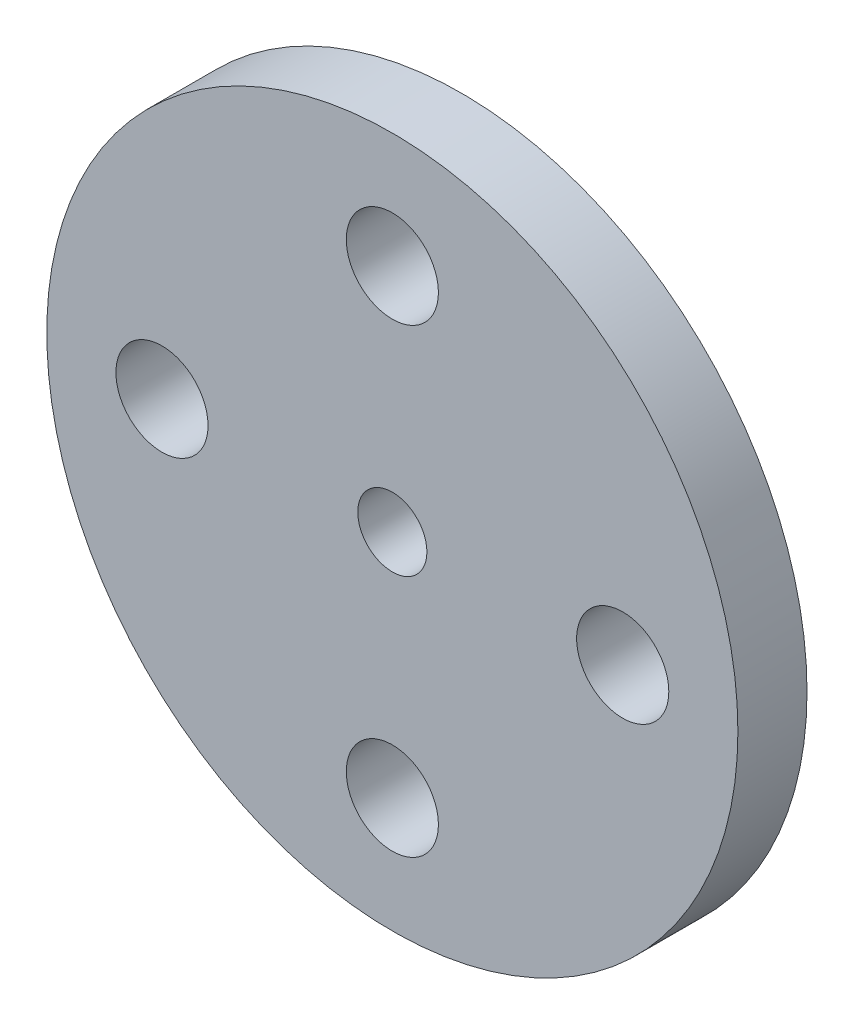
ISO-10303-21;
HEADER;
FILE_DESCRIPTION(('STEP AP214'),'2;1');
FILE_NAME('part.step','',(''),(''),'','','');
FILE_SCHEMA(('AUTOMOTIVE_DESIGN { 1 0 10303 214 1 1 1 1 }'));
ENDSEC;
DATA;
#1=APPLICATION_CONTEXT('core data for automotive mechanical design processes');
#2=APPLICATION_PROTOCOL_DEFINITION('international standard','automotive_design',2000,#1);
#3=PRODUCT_CONTEXT('',#1,'mechanical');
#4=PRODUCT('Part','Part','',(#3));
#5=PRODUCT_RELATED_PRODUCT_CATEGORY('part','',(#4));
#6=PRODUCT_DEFINITION_FORMATION('','',#4);
#7=PRODUCT_DEFINITION_CONTEXT('part definition',#1,'design');
#8=PRODUCT_DEFINITION('design','',#6,#7);
#9=PRODUCT_DEFINITION_SHAPE('','',#8);
#10=(LENGTH_UNIT() NAMED_UNIT(*) SI_UNIT(.MILLI.,.METRE.));
#11=(NAMED_UNIT(*) PLANE_ANGLE_UNIT() SI_UNIT($,.RADIAN.));
#12=(NAMED_UNIT(*) SI_UNIT($,.STERADIAN.) SOLID_ANGLE_UNIT());
#13=UNCERTAINTY_MEASURE_WITH_UNIT(LENGTH_MEASURE(1.E-05),#10,'distance_accuracy_value','');
#14=(GEOMETRIC_REPRESENTATION_CONTEXT(3) GLOBAL_UNCERTAINTY_ASSIGNED_CONTEXT((#13)) GLOBAL_UNIT_ASSIGNED_CONTEXT((#10,
#11,#12)) REPRESENTATION_CONTEXT('',''));
#15=CARTESIAN_POINT('',(0.,0.,0.));
#16=DIRECTION('',(0.,0.,1.));
#17=DIRECTION('',(1.,0.,0.));
#18=AXIS2_PLACEMENT_3D('',#15,#16,#17);
#19=CARTESIAN_POINT('',(0.,0.,0.));
#20=DIRECTION('',(0.,0.,1.));
#21=DIRECTION('',(1.,0.,0.));
#22=AXIS2_PLACEMENT_3D('',#19,#20,#21);
#23=PLANE('',#22);
#24=CARTESIAN_POINT('',(0.,0.,0.));
#25=DIRECTION('',(0.,0.,1.));
#26=DIRECTION('',(1.,0.,0.));
#27=AXIS2_PLACEMENT_3D('',#24,#25,#26);
#28=CIRCLE('',#27,4.5);
#29=CARTESIAN_POINT('',(4.5,0.,0.));
#30=VERTEX_POINT('',#29);
#31=EDGE_CURVE('E35',#30,#30,#28,.T.);
#32=ORIENTED_EDGE('',*,*,#31,.F.);
#33=EDGE_LOOP('',(#32));
#34=FACE_BOUND('',#33,.T.);
#35=CARTESIAN_POINT('',(0.,0.,0.));
#36=DIRECTION('',(0.,0.,1.));
#37=DIRECTION('',(1.,0.,0.));
#38=AXIS2_PLACEMENT_3D('',#35,#36,#37);
#39=CIRCLE('',#38,3.5);
#40=CARTESIAN_POINT('',(3.5,0.,0.));
#41=VERTEX_POINT('',#40);
#42=EDGE_CURVE('E42',#41,#41,#39,.T.);
#43=ORIENTED_EDGE('',*,*,#42,.T.);
#44=EDGE_LOOP('',(#43));
#45=FACE_BOUND('',#44,.T.);
#46=ADVANCED_FACE('F31',(#34,#45),#23,.F.);
#47=CARTESIAN_POINT('',(0.,0.,5.));
#48=DIRECTION('',(0.,0.,-1.));
#49=DIRECTION('',(-1.,0.,0.));
#50=AXIS2_PLACEMENT_3D('',#47,#48,#49);
#51=CYLINDRICAL_SURFACE('',#50,4.5);
#52=CARTESIAN_POINT('',(0.,0.,5.));
#53=DIRECTION('',(0.,0.,1.));
#54=DIRECTION('',(1.,0.,0.));
#55=AXIS2_PLACEMENT_3D('',#52,#53,#54);
#56=CIRCLE('',#55,4.5);
#57=CARTESIAN_POINT('',(4.5,0.,5.));
#58=VERTEX_POINT('',#57);
#59=EDGE_CURVE('E10',#58,#58,#56,.T.);
#60=ORIENTED_EDGE('',*,*,#59,.F.);
#61=EDGE_LOOP('',(#60));
#62=FACE_BOUND('',#61,.T.);
#63=ORIENTED_EDGE('',*,*,#31,.T.);
#64=EDGE_LOOP('',(#63));
#65=FACE_BOUND('',#64,.T.);
#66=ADVANCED_FACE('F33',(#62,#65),#51,.T.);
#67=CARTESIAN_POINT('',(0.,0.,5.));
#68=DIRECTION('',(0.,0.,-1.));
#69=DIRECTION('',(-1.,0.,0.));
#70=AXIS2_PLACEMENT_3D('',#67,#68,#69);
#71=CYLINDRICAL_SURFACE('',#70,3.5);
#72=CARTESIAN_POINT('',(0.,0.,5.));
#73=DIRECTION('',(0.,0.,1.));
#74=DIRECTION('',(1.,0.,0.));
#75=AXIS2_PLACEMENT_3D('',#72,#73,#74);
#76=CIRCLE('',#75,3.5);
#77=CARTESIAN_POINT('',(3.5,0.,5.));
#78=VERTEX_POINT('',#77);
#79=EDGE_CURVE('E46',#78,#78,#76,.T.);
#80=ORIENTED_EDGE('',*,*,#79,.T.);
#81=EDGE_LOOP('',(#80));
#82=FACE_BOUND('',#81,.T.);
#83=ORIENTED_EDGE('',*,*,#42,.F.);
#84=EDGE_LOOP('',(#83));
#85=FACE_BOUND('',#84,.T.);
#86=ADVANCED_FACE('F129',(#82,#85),#71,.F.);
#87=CARTESIAN_POINT('',(0.,0.,5.));
#88=DIRECTION('',(0.,0.,1.));
#89=DIRECTION('',(1.,0.,0.));
#90=AXIS2_PLACEMENT_3D('',#87,#88,#89);
#91=PLANE('',#90);
#92=CARTESIAN_POINT('',(0.,0.,5.));
#93=DIRECTION('',(0.,0.,1.));
#94=DIRECTION('',(1.,0.,0.));
#95=AXIS2_PLACEMENT_3D('',#92,#93,#94);
#96=CIRCLE('',#95,1.5);
#97=CARTESIAN_POINT('',(1.5,0.,5.));
#98=VERTEX_POINT('',#97);
#99=EDGE_CURVE('E60',#98,#98,#96,.T.);
#100=ORIENTED_EDGE('',*,*,#99,.T.);
#101=EDGE_LOOP('',(#100));
#102=FACE_BOUND('',#101,.T.);
#103=ORIENTED_EDGE('',*,*,#79,.F.);
#104=EDGE_LOOP('',(#103));
#105=FACE_BOUND('',#104,.T.);
#106=ADVANCED_FACE('F86',(#102,#105),#91,.F.);
#107=CARTESIAN_POINT('',(0.,0.,8.));
#108=DIRECTION('',(0.,0.,-1.));
#109=DIRECTION('',(-1.,0.,0.));
#110=AXIS2_PLACEMENT_3D('',#107,#108,#109);
#111=CYLINDRICAL_SURFACE('',#110,15.);
#112=CARTESIAN_POINT('',(0.,0.,8.));
#113=DIRECTION('',(0.,0.,1.));
#114=DIRECTION('',(1.,0.,0.));
#115=AXIS2_PLACEMENT_3D('',#112,#113,#114);
#116=CIRCLE('',#115,15.);
#117=CARTESIAN_POINT('',(15.,0.,8.));
#118=VERTEX_POINT('',#117);
#119=EDGE_CURVE('E49',#118,#118,#116,.T.);
#120=ORIENTED_EDGE('',*,*,#119,.F.);
#121=EDGE_LOOP('',(#120));
#122=FACE_BOUND('',#121,.T.);
#123=CARTESIAN_POINT('',(0.,0.,5.));
#124=DIRECTION('',(0.,0.,1.));
#125=DIRECTION('',(1.,0.,0.));
#126=AXIS2_PLACEMENT_3D('',#123,#124,#125);
#127=CIRCLE('',#126,15.);
#128=CARTESIAN_POINT('',(15.,0.,5.));
#129=VERTEX_POINT('',#128);
#130=EDGE_CURVE('E50',#129,#129,#127,.T.);
#131=ORIENTED_EDGE('',*,*,#130,.T.);
#132=EDGE_LOOP('',(#131));
#133=FACE_BOUND('',#132,.T.);
#134=ADVANCED_FACE('F100',(#122,#133),#111,.T.);
#135=CARTESIAN_POINT('',(0.,0.,8.));
#136=DIRECTION('',(0.,0.,1.));
#137=DIRECTION('',(1.,0.,0.));
#138=AXIS2_PLACEMENT_3D('',#135,#136,#137);
#139=PLANE('',#138);
#140=CARTESIAN_POINT('',(0.,0.,8.));
#141=DIRECTION('',(0.,0.,1.));
#142=DIRECTION('',(1.,0.,0.));
#143=AXIS2_PLACEMENT_3D('',#140,#141,#142);
#144=CIRCLE('',#143,1.5);
#145=CARTESIAN_POINT('',(1.5,0.,8.));
#146=VERTEX_POINT('',#145);
#147=EDGE_CURVE('E80',#146,#146,#144,.T.);
#148=ORIENTED_EDGE('',*,*,#147,.F.);
#149=EDGE_LOOP('',(#148));
#150=FACE_BOUND('',#149,.T.);
#151=CARTESIAN_POINT('',(-10.,0.,8.));
#152=DIRECTION('',(0.,0.,1.));
#153=DIRECTION('',(1.,0.,0.));
#154=AXIS2_PLACEMENT_3D('',#151,#152,#153);
#155=CIRCLE('',#154,2.);
#156=CARTESIAN_POINT('',(-8.,0.,8.));
#157=VERTEX_POINT('',#156);
#158=EDGE_CURVE('E75',#157,#157,#155,.T.);
#159=ORIENTED_EDGE('',*,*,#158,.F.);
#160=EDGE_LOOP('',(#159));
#161=FACE_BOUND('',#160,.T.);
#162=CARTESIAN_POINT('',(10.,0.,8.));
#163=DIRECTION('',(0.,0.,1.));
#164=DIRECTION('',(1.,0.,0.));
#165=AXIS2_PLACEMENT_3D('',#162,#163,#164);
#166=CIRCLE('',#165,2.);
#167=CARTESIAN_POINT('',(12.,0.,8.));
#168=VERTEX_POINT('',#167);
#169=EDGE_CURVE('E69',#168,#168,#166,.T.);
#170=ORIENTED_EDGE('',*,*,#169,.F.);
#171=EDGE_LOOP('',(#170));
#172=FACE_BOUND('',#171,.T.);
#173=CARTESIAN_POINT('',(0.,10.,8.));
#174=DIRECTION('',(0.,0.,1.));
#175=DIRECTION('',(1.,0.,0.));
#176=AXIS2_PLACEMENT_3D('',#173,#174,#175);
#177=CIRCLE('',#176,2.);
#178=CARTESIAN_POINT('',(2.,10.,8.));
#179=VERTEX_POINT('',#178);
#180=EDGE_CURVE('E63',#179,#179,#177,.T.);
#181=ORIENTED_EDGE('',*,*,#180,.F.);
#182=EDGE_LOOP('',(#181));
#183=FACE_BOUND('',#182,.T.);
#184=CARTESIAN_POINT('',(0.,-10.,8.));
#185=DIRECTION('',(0.,0.,1.));
#186=DIRECTION('',(1.,0.,0.));
#187=AXIS2_PLACEMENT_3D('',#184,#185,#186);
#188=CIRCLE('',#187,2.);
#189=CARTESIAN_POINT('',(2.,-10.,8.));
#190=VERTEX_POINT('',#189);
#191=EDGE_CURVE('E56',#190,#190,#188,.T.);
#192=ORIENTED_EDGE('',*,*,#191,.F.);
#193=EDGE_LOOP('',(#192));
#194=FACE_BOUND('',#193,.T.);
#195=ORIENTED_EDGE('',*,*,#119,.T.);
#196=EDGE_LOOP('',(#195));
#197=FACE_BOUND('',#196,.T.);
#198=ADVANCED_FACE('F96',(#150,#161,#172,#183,#194,#197),#139,.T.);
#199=CARTESIAN_POINT('',(-10.,0.,5.));
#200=DIRECTION('',(0.,0.,1.));
#201=DIRECTION('',(1.,0.,0.));
#202=AXIS2_PLACEMENT_3D('',#199,#200,#201);
#203=CIRCLE('',#202,2.);
#204=CARTESIAN_POINT('',(-8.,0.,5.));
#205=VERTEX_POINT('',#204);
#206=EDGE_CURVE('E53',#205,#205,#203,.T.);
#207=ORIENTED_EDGE('',*,*,#206,.T.);
#208=EDGE_LOOP('',(#207));
#209=FACE_BOUND('',#208,.T.);
#210=CARTESIAN_POINT('',(10.,0.,5.));
#211=DIRECTION('',(0.,0.,1.));
#212=DIRECTION('',(1.,0.,0.));
#213=AXIS2_PLACEMENT_3D('',#210,#211,#212);
#214=CIRCLE('',#213,2.);
#215=CARTESIAN_POINT('',(12.,0.,5.));
#216=VERTEX_POINT('',#215);
#217=EDGE_CURVE('E72',#216,#216,#214,.T.);
#218=ORIENTED_EDGE('',*,*,#217,.T.);
#219=EDGE_LOOP('',(#218));
#220=FACE_BOUND('',#219,.T.);
#221=CARTESIAN_POINT('',(0.,10.,5.));
#222=DIRECTION('',(0.,0.,1.));
#223=DIRECTION('',(1.,0.,0.));
#224=AXIS2_PLACEMENT_3D('',#221,#222,#223);
#225=CIRCLE('',#224,2.);
#226=CARTESIAN_POINT('',(2.,10.,5.));
#227=VERTEX_POINT('',#226);
#228=EDGE_CURVE('E66',#227,#227,#225,.T.);
#229=ORIENTED_EDGE('',*,*,#228,.T.);
#230=EDGE_LOOP('',(#229));
#231=FACE_BOUND('',#230,.T.);
#232=CARTESIAN_POINT('',(0.,-10.,5.));
#233=DIRECTION('',(0.,0.,1.));
#234=DIRECTION('',(1.,0.,0.));
#235=AXIS2_PLACEMENT_3D('',#232,#233,#234);
#236=CIRCLE('',#235,2.);
#237=CARTESIAN_POINT('',(2.,-10.,5.));
#238=VERTEX_POINT('',#237);
#239=EDGE_CURVE('E59',#238,#238,#236,.T.);
#240=ORIENTED_EDGE('',*,*,#239,.T.);
#241=EDGE_LOOP('',(#240));
#242=FACE_BOUND('',#241,.T.);
#243=ORIENTED_EDGE('',*,*,#59,.T.);
#244=EDGE_LOOP('',(#243));
#245=FACE_BOUND('',#244,.T.);
#246=ORIENTED_EDGE('',*,*,#130,.F.);
#247=EDGE_LOOP('',(#246));
#248=FACE_BOUND('',#247,.T.);
#249=ADVANCED_FACE('F99',(#209,#220,#231,#242,#245,#248),#91,.F.);
#250=CARTESIAN_POINT('',(0.,-10.,5.));
#251=DIRECTION('',(0.,0.,1.));
#252=DIRECTION('',(1.,0.,0.));
#253=AXIS2_PLACEMENT_3D('',#250,#251,#252);
#254=CYLINDRICAL_SURFACE('',#253,2.);
#255=ORIENTED_EDGE('',*,*,#239,.F.);
#256=EDGE_LOOP('',(#255));
#257=FACE_BOUND('',#256,.T.);
#258=ORIENTED_EDGE('',*,*,#191,.T.);
#259=EDGE_LOOP('',(#258));
#260=FACE_BOUND('',#259,.T.);
#261=ADVANCED_FACE('F118',(#257,#260),#254,.F.);
#262=CARTESIAN_POINT('',(0.,10.,5.));
#263=DIRECTION('',(0.,0.,1.));
#264=DIRECTION('',(1.,0.,0.));
#265=AXIS2_PLACEMENT_3D('',#262,#263,#264);
#266=CYLINDRICAL_SURFACE('',#265,2.);
#267=ORIENTED_EDGE('',*,*,#228,.F.);
#268=EDGE_LOOP('',(#267));
#269=FACE_BOUND('',#268,.T.);
#270=ORIENTED_EDGE('',*,*,#180,.T.);
#271=EDGE_LOOP('',(#270));
#272=FACE_BOUND('',#271,.T.);
#273=ADVANCED_FACE('F124',(#269,#272),#266,.F.);
#274=CARTESIAN_POINT('',(10.,0.,5.));
#275=DIRECTION('',(0.,0.,1.));
#276=DIRECTION('',(1.,0.,0.));
#277=AXIS2_PLACEMENT_3D('',#274,#275,#276);
#278=CYLINDRICAL_SURFACE('',#277,2.);
#279=ORIENTED_EDGE('',*,*,#217,.F.);
#280=EDGE_LOOP('',(#279));
#281=FACE_BOUND('',#280,.T.);
#282=ORIENTED_EDGE('',*,*,#169,.T.);
#283=EDGE_LOOP('',(#282));
#284=FACE_BOUND('',#283,.T.);
#285=ADVANCED_FACE('F176',(#281,#284),#278,.F.);
#286=CARTESIAN_POINT('',(-10.,0.,5.));
#287=DIRECTION('',(0.,0.,1.));
#288=DIRECTION('',(1.,0.,0.));
#289=AXIS2_PLACEMENT_3D('',#286,#287,#288);
#290=CYLINDRICAL_SURFACE('',#289,2.);
#291=ORIENTED_EDGE('',*,*,#206,.F.);
#292=EDGE_LOOP('',(#291));
#293=FACE_BOUND('',#292,.T.);
#294=ORIENTED_EDGE('',*,*,#158,.T.);
#295=EDGE_LOOP('',(#294));
#296=FACE_BOUND('',#295,.T.);
#297=ADVANCED_FACE('F92',(#293,#296),#290,.F.);
#298=CARTESIAN_POINT('',(0.,0.,5.));
#299=DIRECTION('',(0.,0.,1.));
#300=DIRECTION('',(1.,0.,0.));
#301=AXIS2_PLACEMENT_3D('',#298,#299,#300);
#302=CYLINDRICAL_SURFACE('',#301,1.5);
#303=ORIENTED_EDGE('',*,*,#99,.F.);
#304=EDGE_LOOP('',(#303));
#305=FACE_BOUND('',#304,.T.);
#306=ORIENTED_EDGE('',*,*,#147,.T.);
#307=EDGE_LOOP('',(#306));
#308=FACE_BOUND('',#307,.T.);
#309=ADVANCED_FACE('F89',(#305,#308),#302,.F.);
#310=CLOSED_SHELL('',(#46,#66,#86,#106,#134,#198,#249,#261,#273,#285,#297,#309));
#311=MANIFOLD_SOLID_BREP('B2',#310);
#312=ADVANCED_BREP_SHAPE_REPRESENTATION('',(#18,#311),#14);
#313=SHAPE_DEFINITION_REPRESENTATION(#9,#312);
ENDSEC;
END-ISO-10303-21;
